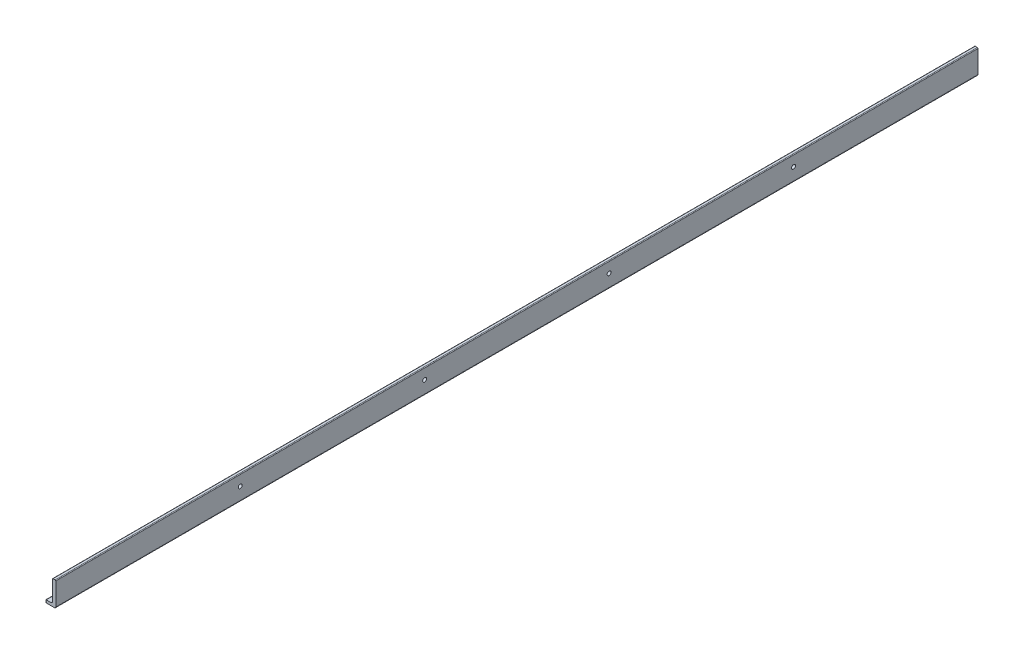
ISO-10303-21;
HEADER;
FILE_DESCRIPTION(('STEP AP214'),'2;1');
FILE_NAME('part.step','',(''),(''),'','','');
FILE_SCHEMA(('AUTOMOTIVE_DESIGN { 1 0 10303 214 1 1 1 1 }'));
ENDSEC;
DATA;
#1=APPLICATION_CONTEXT('core data for automotive mechanical design processes');
#2=APPLICATION_PROTOCOL_DEFINITION('international standard','automotive_design',2000,#1);
#3=PRODUCT_CONTEXT('',#1,'mechanical');
#4=PRODUCT('Part','Part','',(#3));
#5=PRODUCT_RELATED_PRODUCT_CATEGORY('part','',(#4));
#6=PRODUCT_DEFINITION_FORMATION('','',#4);
#7=PRODUCT_DEFINITION_CONTEXT('part definition',#1,'design');
#8=PRODUCT_DEFINITION('design','',#6,#7);
#9=PRODUCT_DEFINITION_SHAPE('','',#8);
#10=(LENGTH_UNIT() NAMED_UNIT(*) SI_UNIT(.MILLI.,.METRE.));
#11=(NAMED_UNIT(*) PLANE_ANGLE_UNIT() SI_UNIT($,.RADIAN.));
#12=(NAMED_UNIT(*) SI_UNIT($,.STERADIAN.) SOLID_ANGLE_UNIT());
#13=UNCERTAINTY_MEASURE_WITH_UNIT(LENGTH_MEASURE(1.E-05),#10,'distance_accuracy_value','');
#14=(GEOMETRIC_REPRESENTATION_CONTEXT(3) GLOBAL_UNCERTAINTY_ASSIGNED_CONTEXT((#13)) GLOBAL_UNIT_ASSIGNED_CONTEXT((#10,
#11,#12)) REPRESENTATION_CONTEXT('',''));
#15=CARTESIAN_POINT('',(0.,0.,0.));
#16=DIRECTION('',(0.,0.,1.));
#17=DIRECTION('',(1.,0.,0.));
#18=AXIS2_PLACEMENT_3D('',#15,#16,#17);
#19=CARTESIAN_POINT('',(-7.5,0.,680.));
#20=DIRECTION('',(0.,1.,0.));
#21=DIRECTION('',(0.,0.,1.));
#22=AXIS2_PLACEMENT_3D('',#19,#20,#21);
#23=PLANE('',#22);
#24=DIRECTION('',(1.,0.,0.));
#25=VECTOR('',#24,1.);
#26=CARTESIAN_POINT('',(-7.5,0.,680.));
#27=LINE('',#26,#25);
#28=CARTESIAN_POINT('',(-7.,0.,680.));
#29=VERTEX_POINT('',#28);
#30=CARTESIAN_POINT('',(-1.,0.,680.));
#31=VERTEX_POINT('',#30);
#32=EDGE_CURVE('E158',#29,#31,#27,.T.);
#33=ORIENTED_EDGE('',*,*,#32,.F.);
#34=DIRECTION('',(0.,0.,-1.));
#35=VECTOR('',#34,1.);
#36=CARTESIAN_POINT('',(-7.,0.,680.));
#37=LINE('',#36,#35);
#38=CARTESIAN_POINT('',(-7.,0.,0.));
#39=VERTEX_POINT('',#38);
#40=EDGE_CURVE('E196',#29,#39,#37,.T.);
#41=ORIENTED_EDGE('',*,*,#40,.T.);
#42=DIRECTION('',(1.,0.,0.));
#43=VECTOR('',#42,1.);
#44=CARTESIAN_POINT('',(-7.5,0.,0.));
#45=LINE('',#44,#43);
#46=CARTESIAN_POINT('',(-1.,0.,0.));
#47=VERTEX_POINT('',#46);
#48=EDGE_CURVE('E246',#39,#47,#45,.T.);
#49=ORIENTED_EDGE('',*,*,#48,.T.);
#50=DIRECTION('',(0.,0.,-1.));
#51=VECTOR('',#50,1.);
#52=CARTESIAN_POINT('',(-1.,0.,680.));
#53=LINE('',#52,#51);
#54=EDGE_CURVE('E174',#47,#31,#53,.F.);
#55=ORIENTED_EDGE('',*,*,#54,.T.);
#56=EDGE_LOOP('',(#33,#41,#49,#55));
#57=FACE_BOUND('',#56,.T.);
#58=ADVANCED_FACE('F40',(#57),#23,.F.);
#59=CARTESIAN_POINT('',(0.,0.,680.));
#60=DIRECTION('',(-1.,0.,0.));
#61=DIRECTION('',(0.,0.,1.));
#62=AXIS2_PLACEMENT_3D('',#59,#60,#61);
#63=PLANE('',#62);
#64=CARTESIAN_POINT('',(0.,10.,136.));
#65=DIRECTION('',(-1.,0.,0.));
#66=DIRECTION('',(0.,0.,1.));
#67=AXIS2_PLACEMENT_3D('',#64,#65,#66);
#68=CIRCLE('',#67,1.45);
#69=CARTESIAN_POINT('',(0.,10.,137.45));
#70=VERTEX_POINT('',#69);
#71=EDGE_CURVE('E222',#70,#70,#68,.T.);
#72=ORIENTED_EDGE('',*,*,#71,.T.);
#73=EDGE_LOOP('',(#72));
#74=FACE_BOUND('',#73,.T.);
#75=CARTESIAN_POINT('',(0.,10.,272.));
#76=DIRECTION('',(-1.,0.,0.));
#77=DIRECTION('',(0.,0.,1.));
#78=AXIS2_PLACEMENT_3D('',#75,#76,#77);
#79=CIRCLE('',#78,1.45);
#80=CARTESIAN_POINT('',(0.,10.,273.45));
#81=VERTEX_POINT('',#80);
#82=EDGE_CURVE('E232',#81,#81,#79,.T.);
#83=ORIENTED_EDGE('',*,*,#82,.T.);
#84=EDGE_LOOP('',(#83));
#85=FACE_BOUND('',#84,.T.);
#86=CARTESIAN_POINT('',(0.,10.,408.));
#87=DIRECTION('',(-1.,0.,0.));
#88=DIRECTION('',(0.,0.,1.));
#89=AXIS2_PLACEMENT_3D('',#86,#87,#88);
#90=CIRCLE('',#89,1.45);
#91=CARTESIAN_POINT('',(0.,10.,409.45));
#92=VERTEX_POINT('',#91);
#93=EDGE_CURVE('E238',#92,#92,#90,.T.);
#94=ORIENTED_EDGE('',*,*,#93,.T.);
#95=EDGE_LOOP('',(#94));
#96=FACE_BOUND('',#95,.T.);
#97=CARTESIAN_POINT('',(0.,10.,544.));
#98=DIRECTION('',(-1.,0.,0.));
#99=DIRECTION('',(0.,0.,1.));
#100=AXIS2_PLACEMENT_3D('',#97,#98,#99);
#101=CIRCLE('',#100,1.45);
#102=CARTESIAN_POINT('',(0.,10.,545.45));
#103=VERTEX_POINT('',#102);
#104=EDGE_CURVE('E244',#103,#103,#101,.T.);
#105=ORIENTED_EDGE('',*,*,#104,.T.);
#106=EDGE_LOOP('',(#105));
#107=FACE_BOUND('',#106,.T.);
#108=DIRECTION('',(0.,1.,0.));
#109=VECTOR('',#108,1.);
#110=CARTESIAN_POINT('',(0.,0.,0.));
#111=LINE('',#110,#109);
#112=CARTESIAN_POINT('',(0.,1.,0.));
#113=VERTEX_POINT('',#112);
#114=CARTESIAN_POINT('',(0.,17.5,0.));
#115=VERTEX_POINT('',#114);
#116=EDGE_CURVE('E257',#113,#115,#111,.T.);
#117=ORIENTED_EDGE('',*,*,#116,.T.);
#118=DIRECTION('',(0.,0.,-1.));
#119=VECTOR('',#118,1.);
#120=CARTESIAN_POINT('',(0.,17.5,680.));
#121=LINE('',#120,#119);
#122=CARTESIAN_POINT('',(0.,17.5,680.));
#123=VERTEX_POINT('',#122);
#124=EDGE_CURVE('E11',#115,#123,#121,.F.);
#125=ORIENTED_EDGE('',*,*,#124,.T.);
#126=DIRECTION('',(0.,1.,0.));
#127=VECTOR('',#126,1.);
#128=CARTESIAN_POINT('',(0.,0.,680.));
#129=LINE('',#128,#127);
#130=CARTESIAN_POINT('',(0.,1.,680.));
#131=VERTEX_POINT('',#130);
#132=EDGE_CURVE('E161',#131,#123,#129,.T.);
#133=ORIENTED_EDGE('',*,*,#132,.F.);
#134=DIRECTION('',(0.,0.,-1.));
#135=VECTOR('',#134,1.);
#136=CARTESIAN_POINT('',(0.,1.,680.));
#137=LINE('',#136,#135);
#138=EDGE_CURVE('E168',#131,#113,#137,.T.);
#139=ORIENTED_EDGE('',*,*,#138,.T.);
#140=EDGE_LOOP('',(#117,#125,#133,#139));
#141=FACE_BOUND('',#140,.T.);
#142=ADVANCED_FACE('F299',(#74,#85,#96,#107,#141),#63,.F.);
#143=CARTESIAN_POINT('',(0.,18.,680.));
#144=DIRECTION('',(0.,-1.,0.));
#145=DIRECTION('',(0.,0.,-1.));
#146=AXIS2_PLACEMENT_3D('',#143,#144,#145);
#147=PLANE('',#146);
#148=DIRECTION('',(-1.,0.,0.));
#149=VECTOR('',#148,1.);
#150=CARTESIAN_POINT('',(0.,18.,0.));
#151=LINE('',#150,#149);
#152=CARTESIAN_POINT('',(-0.5,18.,0.));
#153=VERTEX_POINT('',#152);
#154=CARTESIAN_POINT('',(-2.,18.,0.));
#155=VERTEX_POINT('',#154);
#156=EDGE_CURVE('E163',#153,#155,#151,.T.);
#157=ORIENTED_EDGE('',*,*,#156,.T.);
#158=DIRECTION('',(0.,0.,-1.));
#159=VECTOR('',#158,1.);
#160=CARTESIAN_POINT('',(-2.,18.,680.));
#161=LINE('',#160,#159);
#162=CARTESIAN_POINT('',(-2.,18.,680.));
#163=VERTEX_POINT('',#162);
#164=EDGE_CURVE('E49',#155,#163,#161,.F.);
#165=ORIENTED_EDGE('',*,*,#164,.T.);
#166=DIRECTION('',(-1.,0.,0.));
#167=VECTOR('',#166,1.);
#168=CARTESIAN_POINT('',(0.,18.,680.));
#169=LINE('',#168,#167);
#170=CARTESIAN_POINT('',(-0.5,18.,680.));
#171=VERTEX_POINT('',#170);
#172=EDGE_CURVE('E250',#171,#163,#169,.T.);
#173=ORIENTED_EDGE('',*,*,#172,.F.);
#174=DIRECTION('',(0.,0.,-1.));
#175=VECTOR('',#174,1.);
#176=CARTESIAN_POINT('',(-0.5,18.,680.));
#177=LINE('',#176,#175);
#178=EDGE_CURVE('E204',#171,#153,#177,.T.);
#179=ORIENTED_EDGE('',*,*,#178,.T.);
#180=EDGE_LOOP('',(#157,#165,#173,#179));
#181=FACE_BOUND('',#180,.T.);
#182=ADVANCED_FACE('F261',(#181),#147,.F.);
#183=CARTESIAN_POINT('',(-2.5,18.,680.));
#184=DIRECTION('',(1.,0.,0.));
#185=DIRECTION('',(0.,1.,0.));
#186=AXIS2_PLACEMENT_3D('',#183,#184,#185);
#187=PLANE('',#186);
#188=CARTESIAN_POINT('',(-2.5,10.,136.));
#189=DIRECTION('',(-1.,0.,0.));
#190=DIRECTION('',(0.,0.,1.));
#191=AXIS2_PLACEMENT_3D('',#188,#189,#190);
#192=CIRCLE('',#191,1.44999999999999);
#193=CARTESIAN_POINT('',(-2.5,10.,137.45));
#194=VERTEX_POINT('',#193);
#195=EDGE_CURVE('E216',#194,#194,#192,.T.);
#196=ORIENTED_EDGE('',*,*,#195,.F.);
#197=EDGE_LOOP('',(#196));
#198=FACE_BOUND('',#197,.T.);
#199=CARTESIAN_POINT('',(-2.5,10.,272.));
#200=DIRECTION('',(-1.,0.,0.));
#201=DIRECTION('',(0.,0.,1.));
#202=AXIS2_PLACEMENT_3D('',#199,#200,#201);
#203=CIRCLE('',#202,1.44999999999999);
#204=CARTESIAN_POINT('',(-2.5,10.,273.45));
#205=VERTEX_POINT('',#204);
#206=EDGE_CURVE('E227',#205,#205,#203,.T.);
#207=ORIENTED_EDGE('',*,*,#206,.F.);
#208=EDGE_LOOP('',(#207));
#209=FACE_BOUND('',#208,.T.);
#210=CARTESIAN_POINT('',(-2.5,10.,408.));
#211=DIRECTION('',(-1.,0.,0.));
#212=DIRECTION('',(0.,0.,1.));
#213=AXIS2_PLACEMENT_3D('',#210,#211,#212);
#214=CIRCLE('',#213,1.44999999999999);
#215=CARTESIAN_POINT('',(-2.5,10.,409.45));
#216=VERTEX_POINT('',#215);
#217=EDGE_CURVE('E235',#216,#216,#214,.T.);
#218=ORIENTED_EDGE('',*,*,#217,.F.);
#219=EDGE_LOOP('',(#218));
#220=FACE_BOUND('',#219,.T.);
#221=CARTESIAN_POINT('',(-2.5,10.,544.));
#222=DIRECTION('',(-1.,0.,0.));
#223=DIRECTION('',(0.,0.,1.));
#224=AXIS2_PLACEMENT_3D('',#221,#222,#223);
#225=CIRCLE('',#224,1.44999999999999);
#226=CARTESIAN_POINT('',(-2.5,10.,545.45));
#227=VERTEX_POINT('',#226);
#228=EDGE_CURVE('E241',#227,#227,#225,.T.);
#229=ORIENTED_EDGE('',*,*,#228,.F.);
#230=EDGE_LOOP('',(#229));
#231=FACE_BOUND('',#230,.T.);
#232=DIRECTION('',(0.,-1.,0.));
#233=VECTOR('',#232,1.);
#234=CARTESIAN_POINT('',(-2.5,18.,680.));
#235=LINE('',#234,#233);
#236=CARTESIAN_POINT('',(-2.5,17.5,680.));
#237=VERTEX_POINT('',#236);
#238=CARTESIAN_POINT('',(-2.5,3.,680.));
#239=VERTEX_POINT('',#238);
#240=EDGE_CURVE('E253',#237,#239,#235,.T.);
#241=ORIENTED_EDGE('',*,*,#240,.F.);
#242=DIRECTION('',(0.,0.,-1.));
#243=VECTOR('',#242,1.);
#244=CARTESIAN_POINT('',(-2.5,17.5,680.));
#245=LINE('',#244,#243);
#246=CARTESIAN_POINT('',(-2.5,17.5,0.));
#247=VERTEX_POINT('',#246);
#248=EDGE_CURVE('E201',#237,#247,#245,.T.);
#249=ORIENTED_EDGE('',*,*,#248,.T.);
#250=DIRECTION('',(0.,-1.,0.));
#251=VECTOR('',#250,1.);
#252=CARTESIAN_POINT('',(-2.5,18.,0.));
#253=LINE('',#252,#251);
#254=CARTESIAN_POINT('',(-2.5,3.,0.));
#255=VERTEX_POINT('',#254);
#256=EDGE_CURVE('E159',#247,#255,#253,.T.);
#257=ORIENTED_EDGE('',*,*,#256,.T.);
#258=DIRECTION('',(0.,0.,-1.));
#259=VECTOR('',#258,1.);
#260=CARTESIAN_POINT('',(-2.5,3.,680.));
#261=LINE('',#260,#259);
#262=EDGE_CURVE('E139',#255,#239,#261,.F.);
#263=ORIENTED_EDGE('',*,*,#262,.T.);
#264=EDGE_LOOP('',(#241,#249,#257,#263));
#265=FACE_BOUND('',#264,.T.);
#266=ADVANCED_FACE('F271',(#198,#209,#220,#231,#265),#187,.F.);
#267=CARTESIAN_POINT('',(-2.5,2.,680.));
#268=DIRECTION('',(0.,-1.,0.));
#269=DIRECTION('',(1.,0.,0.));
#270=AXIS2_PLACEMENT_3D('',#267,#268,#269);
#271=PLANE('',#270);
#272=DIRECTION('',(-1.,0.,0.));
#273=VECTOR('',#272,1.);
#274=CARTESIAN_POINT('',(-2.5,2.,0.));
#275=LINE('',#274,#273);
#276=CARTESIAN_POINT('',(-3.5,2.,0.));
#277=VERTEX_POINT('',#276);
#278=CARTESIAN_POINT('',(-7.,2.,0.));
#279=VERTEX_POINT('',#278);
#280=EDGE_CURVE('E149',#277,#279,#275,.T.);
#281=ORIENTED_EDGE('',*,*,#280,.T.);
#282=DIRECTION('',(0.,0.,-1.));
#283=VECTOR('',#282,1.);
#284=CARTESIAN_POINT('',(-7.,2.,680.));
#285=LINE('',#284,#283);
#286=CARTESIAN_POINT('',(-7.,2.,680.));
#287=VERTEX_POINT('',#286);
#288=EDGE_CURVE('E188',#279,#287,#285,.F.);
#289=ORIENTED_EDGE('',*,*,#288,.T.);
#290=DIRECTION('',(-1.,0.,0.));
#291=VECTOR('',#290,1.);
#292=CARTESIAN_POINT('',(-2.5,2.,680.));
#293=LINE('',#292,#291);
#294=CARTESIAN_POINT('',(-3.5,2.,680.));
#295=VERTEX_POINT('',#294);
#296=EDGE_CURVE('E152',#295,#287,#293,.T.);
#297=ORIENTED_EDGE('',*,*,#296,.F.);
#298=DIRECTION('',(0.,0.,-1.));
#299=VECTOR('',#298,1.);
#300=CARTESIAN_POINT('',(-3.5,2.,0.));
#301=LINE('',#300,#299);
#302=EDGE_CURVE('E137',#295,#277,#301,.T.);
#303=ORIENTED_EDGE('',*,*,#302,.T.);
#304=EDGE_LOOP('',(#281,#289,#297,#303));
#305=FACE_BOUND('',#304,.T.);
#306=ADVANCED_FACE('F147',(#305),#271,.F.);
#307=CARTESIAN_POINT('',(-7.5,2.,680.));
#308=DIRECTION('',(1.,0.,0.));
#309=DIRECTION('',(0.,0.,-1.));
#310=AXIS2_PLACEMENT_3D('',#307,#308,#309);
#311=PLANE('',#310);
#312=DIRECTION('',(0.,-1.,0.));
#313=VECTOR('',#312,1.);
#314=CARTESIAN_POINT('',(-7.5,2.,679.5));
#315=LINE('',#314,#313);
#316=CARTESIAN_POINT('',(-7.5,0.5,679.5));
#317=VERTEX_POINT('',#316);
#318=CARTESIAN_POINT('',(-7.5,1.5,679.5));
#319=VERTEX_POINT('',#318);
#320=EDGE_CURVE('E183',#317,#319,#315,.F.);
#321=ORIENTED_EDGE('',*,*,#320,.T.);
#322=DIRECTION('',(0.,0.,-1.));
#323=VECTOR('',#322,1.);
#324=CARTESIAN_POINT('',(-7.5,1.5,680.));
#325=LINE('',#324,#323);
#326=CARTESIAN_POINT('',(-7.5,1.5,0.499999999999945));
#327=VERTEX_POINT('',#326);
#328=EDGE_CURVE('E185',#319,#327,#325,.T.);
#329=ORIENTED_EDGE('',*,*,#328,.T.);
#330=DIRECTION('',(0.,-1.,0.));
#331=VECTOR('',#330,1.);
#332=CARTESIAN_POINT('',(-7.5,2.,0.499999999999945));
#333=LINE('',#332,#331);
#334=CARTESIAN_POINT('',(-7.5,0.5,0.499999999999945));
#335=VERTEX_POINT('',#334);
#336=EDGE_CURVE('E179',#327,#335,#333,.T.);
#337=ORIENTED_EDGE('',*,*,#336,.T.);
#338=DIRECTION('',(0.,0.,-1.));
#339=VECTOR('',#338,1.);
#340=CARTESIAN_POINT('',(-7.5,0.5,680.));
#341=LINE('',#340,#339);
#342=EDGE_CURVE('E181',#335,#317,#341,.F.);
#343=ORIENTED_EDGE('',*,*,#342,.T.);
#344=EDGE_LOOP('',(#321,#329,#337,#343));
#345=FACE_BOUND('',#344,.T.);
#346=ADVANCED_FACE('F288',(#345),#311,.F.);
#347=CARTESIAN_POINT('',(0.,0.,680.));
#348=DIRECTION('',(0.,0.,1.));
#349=DIRECTION('',(1.,0.,0.));
#350=AXIS2_PLACEMENT_3D('',#347,#348,#349);
#351=PLANE('',#350);
#352=ORIENTED_EDGE('',*,*,#296,.T.);
#353=DIRECTION('',(0.,-1.,0.));
#354=VECTOR('',#353,1.);
#355=CARTESIAN_POINT('',(-7.,0.,680.));
#356=LINE('',#355,#354);
#357=EDGE_CURVE('E194',#287,#29,#356,.T.);
#358=ORIENTED_EDGE('',*,*,#357,.T.);
#359=ORIENTED_EDGE('',*,*,#32,.T.);
#360=CARTESIAN_POINT('',(-1.,1.,680.));
#361=DIRECTION('',(0.,0.,1.));
#362=DIRECTION('',(1.,0.,0.));
#363=AXIS2_PLACEMENT_3D('',#360,#361,#362);
#364=CIRCLE('',#363,1.);
#365=EDGE_CURVE('E142',#31,#131,#364,.T.);
#366=ORIENTED_EDGE('',*,*,#365,.T.);
#367=ORIENTED_EDGE('',*,*,#132,.T.);
#368=CARTESIAN_POINT('',(-0.5,17.5,680.));
#369=DIRECTION('',(0.,0.,1.));
#370=DIRECTION('',(1.,0.,0.));
#371=AXIS2_PLACEMENT_3D('',#368,#369,#370);
#372=CIRCLE('',#371,0.5);
#373=EDGE_CURVE('E190',#123,#171,#372,.T.);
#374=ORIENTED_EDGE('',*,*,#373,.T.);
#375=ORIENTED_EDGE('',*,*,#172,.T.);
#376=CARTESIAN_POINT('',(-2.,17.5,680.));
#377=DIRECTION('',(0.,0.,1.));
#378=DIRECTION('',(1.,0.,0.));
#379=AXIS2_PLACEMENT_3D('',#376,#377,#378);
#380=CIRCLE('',#379,0.5);
#381=EDGE_CURVE('E192',#163,#237,#380,.T.);
#382=ORIENTED_EDGE('',*,*,#381,.T.);
#383=ORIENTED_EDGE('',*,*,#240,.T.);
#384=CARTESIAN_POINT('',(-3.5,3.,680.));
#385=DIRECTION('',(0.,0.,1.));
#386=DIRECTION('',(1.,0.,0.));
#387=AXIS2_PLACEMENT_3D('',#384,#385,#386);
#388=CIRCLE('',#387,1.);
#389=EDGE_CURVE('E141',#239,#295,#388,.F.);
#390=ORIENTED_EDGE('',*,*,#389,.T.);
#391=EDGE_LOOP('',(#352,#358,#359,#366,#367,#374,#375,#382,#383,#390));
#392=FACE_BOUND('',#391,.T.);
#393=ADVANCED_FACE('F269',(#392),#351,.T.);
#394=CARTESIAN_POINT('',(0.,0.,0.));
#395=DIRECTION('',(0.,0.,1.));
#396=DIRECTION('',(1.,0.,0.));
#397=AXIS2_PLACEMENT_3D('',#394,#395,#396);
#398=PLANE('',#397);
#399=ORIENTED_EDGE('',*,*,#48,.F.);
#400=DIRECTION('',(0.,-1.,0.));
#401=VECTOR('',#400,1.);
#402=CARTESIAN_POINT('',(-7.,0.,0.));
#403=LINE('',#402,#401);
#404=EDGE_CURVE('E157',#39,#279,#403,.F.);
#405=ORIENTED_EDGE('',*,*,#404,.T.);
#406=ORIENTED_EDGE('',*,*,#280,.F.);
#407=CARTESIAN_POINT('',(-3.5,3.,0.));
#408=DIRECTION('',(0.,0.,1.));
#409=DIRECTION('',(1.,0.,0.));
#410=AXIS2_PLACEMENT_3D('',#407,#408,#409);
#411=CIRCLE('',#410,1.);
#412=EDGE_CURVE('E133',#277,#255,#411,.T.);
#413=ORIENTED_EDGE('',*,*,#412,.T.);
#414=ORIENTED_EDGE('',*,*,#256,.F.);
#415=CARTESIAN_POINT('',(-2.,17.5,0.));
#416=DIRECTION('',(0.,0.,1.));
#417=DIRECTION('',(1.,0.,0.));
#418=AXIS2_PLACEMENT_3D('',#415,#416,#417);
#419=CIRCLE('',#418,0.5);
#420=EDGE_CURVE('E57',#247,#155,#419,.F.);
#421=ORIENTED_EDGE('',*,*,#420,.T.);
#422=ORIENTED_EDGE('',*,*,#156,.F.);
#423=CARTESIAN_POINT('',(-0.5,17.5,0.));
#424=DIRECTION('',(0.,0.,1.));
#425=DIRECTION('',(1.,0.,0.));
#426=AXIS2_PLACEMENT_3D('',#423,#424,#425);
#427=CIRCLE('',#426,0.5);
#428=EDGE_CURVE('E65',#153,#115,#427,.F.);
#429=ORIENTED_EDGE('',*,*,#428,.T.);
#430=ORIENTED_EDGE('',*,*,#116,.F.);
#431=CARTESIAN_POINT('',(-1.,1.,0.));
#432=DIRECTION('',(0.,0.,1.));
#433=DIRECTION('',(1.,0.,0.));
#434=AXIS2_PLACEMENT_3D('',#431,#432,#433);
#435=CIRCLE('',#434,1.);
#436=EDGE_CURVE('E171',#113,#47,#435,.F.);
#437=ORIENTED_EDGE('',*,*,#436,.T.);
#438=EDGE_LOOP('',(#399,#405,#406,#413,#414,#421,#422,#429,#430,#437));
#439=FACE_BOUND('',#438,.T.);
#440=ADVANCED_FACE('F155',(#439),#398,.F.);
#441=CARTESIAN_POINT('',(-2.5,10.,544.));
#442=DIRECTION('',(-1.,0.,0.));
#443=DIRECTION('',(0.,0.,1.));
#444=AXIS2_PLACEMENT_3D('',#441,#442,#443);
#445=CYLINDRICAL_SURFACE('',#444,1.44999999999999);
#446=ORIENTED_EDGE('',*,*,#104,.F.);
#447=EDGE_LOOP('',(#446));
#448=FACE_BOUND('',#447,.T.);
#449=ORIENTED_EDGE('',*,*,#228,.T.);
#450=EDGE_LOOP('',(#449));
#451=FACE_BOUND('',#450,.T.);
#452=ADVANCED_FACE('F370',(#448,#451),#445,.F.);
#453=CARTESIAN_POINT('',(-2.5,10.,408.));
#454=DIRECTION('',(-1.,0.,0.));
#455=DIRECTION('',(0.,0.,1.));
#456=AXIS2_PLACEMENT_3D('',#453,#454,#455);
#457=CYLINDRICAL_SURFACE('',#456,1.44999999999999);
#458=ORIENTED_EDGE('',*,*,#93,.F.);
#459=EDGE_LOOP('',(#458));
#460=FACE_BOUND('',#459,.T.);
#461=ORIENTED_EDGE('',*,*,#217,.T.);
#462=EDGE_LOOP('',(#461));
#463=FACE_BOUND('',#462,.T.);
#464=ADVANCED_FACE('F430',(#460,#463),#457,.F.);
#465=CARTESIAN_POINT('',(-2.5,10.,272.));
#466=DIRECTION('',(-1.,0.,0.));
#467=DIRECTION('',(0.,0.,1.));
#468=AXIS2_PLACEMENT_3D('',#465,#466,#467);
#469=CYLINDRICAL_SURFACE('',#468,1.44999999999999);
#470=ORIENTED_EDGE('',*,*,#82,.F.);
#471=EDGE_LOOP('',(#470));
#472=FACE_BOUND('',#471,.T.);
#473=ORIENTED_EDGE('',*,*,#206,.T.);
#474=EDGE_LOOP('',(#473));
#475=FACE_BOUND('',#474,.T.);
#476=ADVANCED_FACE('F435',(#472,#475),#469,.F.);
#477=CARTESIAN_POINT('',(-2.5,10.,136.));
#478=DIRECTION('',(-1.,0.,0.));
#479=DIRECTION('',(0.,0.,1.));
#480=AXIS2_PLACEMENT_3D('',#477,#478,#479);
#481=CYLINDRICAL_SURFACE('',#480,1.44999999999999);
#482=ORIENTED_EDGE('',*,*,#71,.F.);
#483=EDGE_LOOP('',(#482));
#484=FACE_BOUND('',#483,.T.);
#485=ORIENTED_EDGE('',*,*,#195,.T.);
#486=EDGE_LOOP('',(#485));
#487=FACE_BOUND('',#486,.T.);
#488=ADVANCED_FACE('F312',(#484,#487),#481,.F.);
#489=CARTESIAN_POINT('',(-3.5,3.,680.));
#490=DIRECTION('',(0.,0.,1.));
#491=DIRECTION('',(1.,0.,0.));
#492=AXIS2_PLACEMENT_3D('',#489,#490,#491);
#493=CYLINDRICAL_SURFACE('',#492,1.);
#494=ORIENTED_EDGE('',*,*,#389,.F.);
#495=ORIENTED_EDGE('',*,*,#262,.F.);
#496=ORIENTED_EDGE('',*,*,#412,.F.);
#497=ORIENTED_EDGE('',*,*,#302,.F.);
#498=EDGE_LOOP('',(#494,#495,#496,#497));
#499=FACE_BOUND('',#498,.T.);
#500=ADVANCED_FACE('F136',(#499),#493,.F.);
#501=CARTESIAN_POINT('',(-1.,1.,680.));
#502=DIRECTION('',(0.,0.,-1.));
#503=DIRECTION('',(-1.,0.,0.));
#504=AXIS2_PLACEMENT_3D('',#501,#502,#503);
#505=CYLINDRICAL_SURFACE('',#504,1.);
#506=ORIENTED_EDGE('',*,*,#365,.F.);
#507=ORIENTED_EDGE('',*,*,#54,.F.);
#508=ORIENTED_EDGE('',*,*,#436,.F.);
#509=ORIENTED_EDGE('',*,*,#138,.F.);
#510=EDGE_LOOP('',(#506,#507,#508,#509));
#511=FACE_BOUND('',#510,.T.);
#512=ADVANCED_FACE('F311',(#511),#505,.T.);
#513=CARTESIAN_POINT('',(-7.,0.5,680.));
#514=DIRECTION('',(0.,0.,-1.));
#515=DIRECTION('',(-1.,0.,0.));
#516=AXIS2_PLACEMENT_3D('',#513,#514,#515);
#517=CYLINDRICAL_SURFACE('',#516,0.5);
#518=CARTESIAN_POINT('',(-7.,0.5,0.499999999999945));
#519=DIRECTION('',(0.,-0.707106781186547,0.707106781186547));
#520=DIRECTION('',(0.,-0.707106781186547,-0.707106781186547));
#521=AXIS2_PLACEMENT_3D('',#518,#519,#520);
#522=ELLIPSE('',#521,0.707106781186547,0.5);
#523=EDGE_CURVE('E210',#39,#335,#522,.F.);
#524=ORIENTED_EDGE('',*,*,#523,.F.);
#525=ORIENTED_EDGE('',*,*,#40,.F.);
#526=CARTESIAN_POINT('',(-7.,0.5,679.5));
#527=DIRECTION('',(0.,-0.707106781186547,-0.707106781186547));
#528=DIRECTION('',(0.,0.707106781186547,-0.707106781186547));
#529=AXIS2_PLACEMENT_3D('',#526,#527,#528);
#530=ELLIPSE('',#529,0.707106781186547,0.5);
#531=EDGE_CURVE('E44',#317,#29,#530,.F.);
#532=ORIENTED_EDGE('',*,*,#531,.F.);
#533=ORIENTED_EDGE('',*,*,#342,.F.);
#534=EDGE_LOOP('',(#524,#525,#532,#533));
#535=FACE_BOUND('',#534,.T.);
#536=ADVANCED_FACE('F279',(#535),#517,.T.);
#537=CARTESIAN_POINT('',(-7.,0.,679.5));
#538=DIRECTION('',(0.,1.,0.));
#539=DIRECTION('',(0.,0.,1.));
#540=AXIS2_PLACEMENT_3D('',#537,#538,#539);
#541=CYLINDRICAL_SURFACE('',#540,0.5);
#542=ORIENTED_EDGE('',*,*,#531,.T.);
#543=ORIENTED_EDGE('',*,*,#357,.F.);
#544=CARTESIAN_POINT('',(-7.,1.5,679.5));
#545=DIRECTION('',(0.,0.707106781186547,-0.707106781186547));
#546=DIRECTION('',(0.,0.707106781186547,0.707106781186547));
#547=AXIS2_PLACEMENT_3D('',#544,#545,#546);
#548=ELLIPSE('',#547,0.707106781186547,0.5);
#549=EDGE_CURVE('E209',#319,#287,#548,.T.);
#550=ORIENTED_EDGE('',*,*,#549,.F.);
#551=ORIENTED_EDGE('',*,*,#320,.F.);
#552=EDGE_LOOP('',(#542,#543,#550,#551));
#553=FACE_BOUND('',#552,.T.);
#554=ADVANCED_FACE('F286',(#553),#541,.T.);
#555=CARTESIAN_POINT('',(-7.,2.,0.499999999999945));
#556=DIRECTION('',(0.,-1.,0.));
#557=DIRECTION('',(0.,0.,-1.));
#558=AXIS2_PLACEMENT_3D('',#555,#556,#557);
#559=CYLINDRICAL_SURFACE('',#558,0.5);
#560=ORIENTED_EDGE('',*,*,#523,.T.);
#561=ORIENTED_EDGE('',*,*,#336,.F.);
#562=CARTESIAN_POINT('',(-7.,1.5,0.499999999999945));
#563=DIRECTION('',(0.,-0.707106781186547,-0.707106781186547));
#564=DIRECTION('',(0.,-0.707106781186547,0.707106781186547));
#565=AXIS2_PLACEMENT_3D('',#562,#563,#564);
#566=ELLIPSE('',#565,0.707106781186547,0.5);
#567=EDGE_CURVE('E207',#279,#327,#566,.F.);
#568=ORIENTED_EDGE('',*,*,#567,.F.);
#569=ORIENTED_EDGE('',*,*,#404,.F.);
#570=EDGE_LOOP('',(#560,#561,#568,#569));
#571=FACE_BOUND('',#570,.T.);
#572=ADVANCED_FACE('F282',(#571),#559,.T.);
#573=CARTESIAN_POINT('',(-7.,1.5,680.));
#574=DIRECTION('',(0.,0.,-1.));
#575=DIRECTION('',(-1.,0.,0.));
#576=AXIS2_PLACEMENT_3D('',#573,#574,#575);
#577=CYLINDRICAL_SURFACE('',#576,0.5);
#578=ORIENTED_EDGE('',*,*,#549,.T.);
#579=ORIENTED_EDGE('',*,*,#288,.F.);
#580=ORIENTED_EDGE('',*,*,#567,.T.);
#581=ORIENTED_EDGE('',*,*,#328,.F.);
#582=EDGE_LOOP('',(#578,#579,#580,#581));
#583=FACE_BOUND('',#582,.T.);
#584=ADVANCED_FACE('F285',(#583),#577,.T.);
#585=CARTESIAN_POINT('',(-2.,17.5,680.));
#586=DIRECTION('',(0.,0.,-1.));
#587=DIRECTION('',(-1.,0.,0.));
#588=AXIS2_PLACEMENT_3D('',#585,#586,#587);
#589=CYLINDRICAL_SURFACE('',#588,0.5);
#590=ORIENTED_EDGE('',*,*,#381,.F.);
#591=ORIENTED_EDGE('',*,*,#164,.F.);
#592=ORIENTED_EDGE('',*,*,#420,.F.);
#593=ORIENTED_EDGE('',*,*,#248,.F.);
#594=EDGE_LOOP('',(#590,#591,#592,#593));
#595=FACE_BOUND('',#594,.T.);
#596=ADVANCED_FACE('F265',(#595),#589,.T.);
#597=CARTESIAN_POINT('',(-0.5,17.5,680.));
#598=DIRECTION('',(0.,0.,-1.));
#599=DIRECTION('',(-1.,0.,0.));
#600=AXIS2_PLACEMENT_3D('',#597,#598,#599);
#601=CYLINDRICAL_SURFACE('',#600,0.5);
#602=ORIENTED_EDGE('',*,*,#373,.F.);
#603=ORIENTED_EDGE('',*,*,#124,.F.);
#604=ORIENTED_EDGE('',*,*,#428,.F.);
#605=ORIENTED_EDGE('',*,*,#178,.F.);
#606=EDGE_LOOP('',(#602,#603,#604,#605));
#607=FACE_BOUND('',#606,.T.);
#608=ADVANCED_FACE('F42',(#607),#601,.T.);
#609=CLOSED_SHELL('',(#58,#142,#182,#266,#306,#346,#393,#440,#452,#464,#476,#488,#500,#512,#536,
#554,#572,#584,#596,#608));
#610=MANIFOLD_SOLID_BREP('B2',#609);
#611=ADVANCED_BREP_SHAPE_REPRESENTATION('',(#18,#610),#14);
#612=SHAPE_DEFINITION_REPRESENTATION(#9,#611);
ENDSEC;
END-ISO-10303-21;
